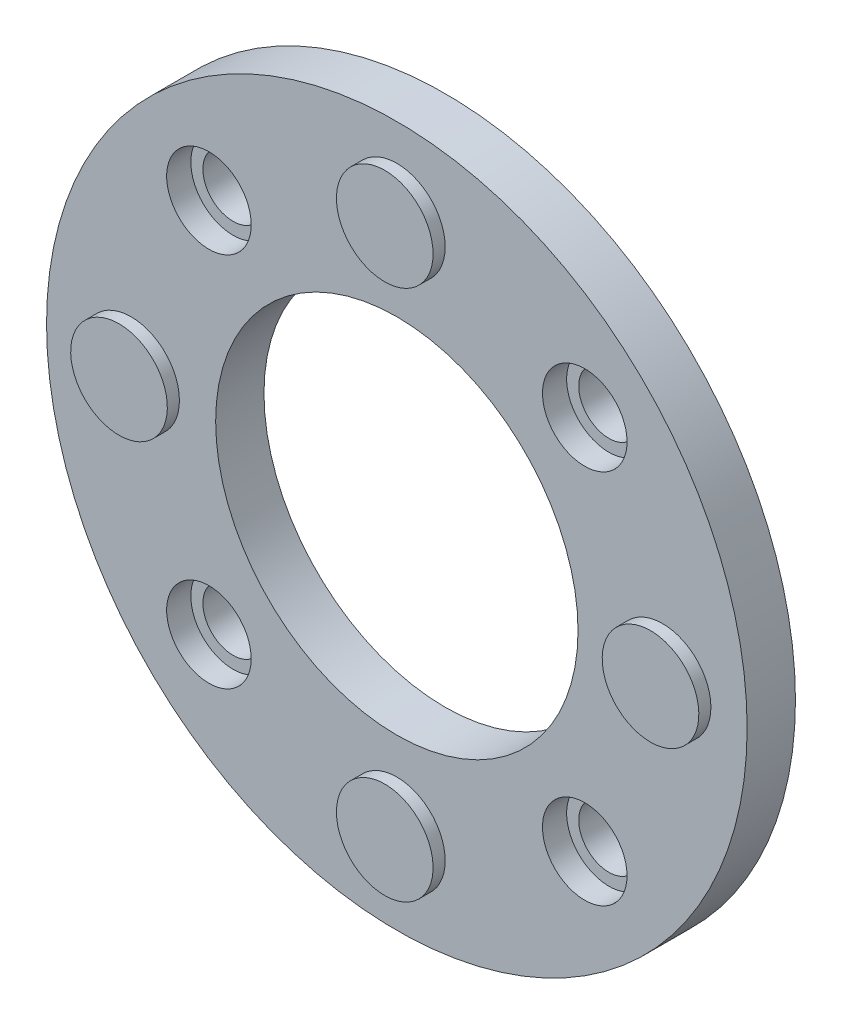
ISO-10303-21;
HEADER;
FILE_DESCRIPTION(('STEP AP214'),'2;1');
FILE_NAME('part.step','',(''),(''),'','','');
FILE_SCHEMA(('AUTOMOTIVE_DESIGN { 1 0 10303 214 1 1 1 1 }'));
ENDSEC;
DATA;
#1=APPLICATION_CONTEXT('core data for automotive mechanical design processes');
#2=APPLICATION_PROTOCOL_DEFINITION('international standard','automotive_design',2000,#1);
#3=PRODUCT_CONTEXT('',#1,'mechanical');
#4=PRODUCT('Part','Part','',(#3));
#5=PRODUCT_RELATED_PRODUCT_CATEGORY('part','',(#4));
#6=PRODUCT_DEFINITION_FORMATION('','',#4);
#7=PRODUCT_DEFINITION_CONTEXT('part definition',#1,'design');
#8=PRODUCT_DEFINITION('design','',#6,#7);
#9=PRODUCT_DEFINITION_SHAPE('','',#8);
#10=(LENGTH_UNIT() NAMED_UNIT(*) SI_UNIT(.MILLI.,.METRE.));
#11=(NAMED_UNIT(*) PLANE_ANGLE_UNIT() SI_UNIT($,.RADIAN.));
#12=(NAMED_UNIT(*) SI_UNIT($,.STERADIAN.) SOLID_ANGLE_UNIT());
#13=UNCERTAINTY_MEASURE_WITH_UNIT(LENGTH_MEASURE(1.E-05),#10,'distance_accuracy_value','');
#14=(GEOMETRIC_REPRESENTATION_CONTEXT(3) GLOBAL_UNCERTAINTY_ASSIGNED_CONTEXT((#13)) GLOBAL_UNIT_ASSIGNED_CONTEXT((#10,
#11,#12)) REPRESENTATION_CONTEXT('',''));
#15=CARTESIAN_POINT('',(0.,0.,0.));
#16=DIRECTION('',(0.,0.,1.));
#17=DIRECTION('',(1.,0.,0.));
#18=AXIS2_PLACEMENT_3D('',#15,#16,#17);
#19=CARTESIAN_POINT('',(0.,0.,-2.));
#20=DIRECTION('',(0.,0.,1.));
#21=DIRECTION('',(1.,0.,0.));
#22=AXIS2_PLACEMENT_3D('',#19,#20,#21);
#23=PLANE('',#22);
#24=CARTESIAN_POINT('',(15.5563491861041,-15.556349186104,-2.));
#25=DIRECTION('',(0.,0.,1.));
#26=DIRECTION('',(1.,0.,0.));
#27=AXIS2_PLACEMENT_3D('',#24,#25,#26);
#28=CIRCLE('',#27,3.5);
#29=CARTESIAN_POINT('',(19.0563491861041,-15.556349186104,-2.));
#30=VERTEX_POINT('',#29);
#31=EDGE_CURVE('E53',#30,#30,#28,.F.);
#32=ORIENTED_EDGE('',*,*,#31,.F.);
#33=EDGE_LOOP('',(#32));
#34=FACE_BOUND('',#33,.T.);
#35=CARTESIAN_POINT('',(-15.5563491861041,15.556349186104,-2.));
#36=DIRECTION('',(0.,0.,1.));
#37=DIRECTION('',(1.,0.,0.));
#38=AXIS2_PLACEMENT_3D('',#35,#36,#37);
#39=CIRCLE('',#38,3.5);
#40=CARTESIAN_POINT('',(-12.0563491861041,15.556349186104,-2.));
#41=VERTEX_POINT('',#40);
#42=EDGE_CURVE('E63',#41,#41,#39,.F.);
#43=ORIENTED_EDGE('',*,*,#42,.F.);
#44=EDGE_LOOP('',(#43));
#45=FACE_BOUND('',#44,.T.);
#46=CARTESIAN_POINT('',(-22.,0.,-2.));
#47=DIRECTION('',(0.,0.,1.));
#48=DIRECTION('',(1.,0.,0.));
#49=AXIS2_PLACEMENT_3D('',#46,#47,#48);
#50=CIRCLE('',#49,4.);
#51=CARTESIAN_POINT('',(-18.,0.,-2.));
#52=VERTEX_POINT('',#51);
#53=EDGE_CURVE('E69',#52,#52,#50,.F.);
#54=ORIENTED_EDGE('',*,*,#53,.F.);
#55=EDGE_LOOP('',(#54));
#56=FACE_BOUND('',#55,.T.);
#57=CARTESIAN_POINT('',(0.,-22.,-2.));
#58=DIRECTION('',(0.,0.,1.));
#59=DIRECTION('',(1.,0.,0.));
#60=AXIS2_PLACEMENT_3D('',#57,#58,#59);
#61=CIRCLE('',#60,4.);
#62=CARTESIAN_POINT('',(4.,-22.,-2.));
#63=VERTEX_POINT('',#62);
#64=EDGE_CURVE('E73',#63,#63,#61,.F.);
#65=ORIENTED_EDGE('',*,*,#64,.F.);
#66=EDGE_LOOP('',(#65));
#67=FACE_BOUND('',#66,.T.);
#68=CARTESIAN_POINT('',(22.,2.30437768363647E-13,-2.));
#69=DIRECTION('',(0.,0.,1.));
#70=DIRECTION('',(1.,0.,0.));
#71=AXIS2_PLACEMENT_3D('',#68,#69,#70);
#72=CIRCLE('',#71,4.);
#73=CARTESIAN_POINT('',(26.,2.30437768363647E-13,-2.));
#74=VERTEX_POINT('',#73);
#75=EDGE_CURVE('E77',#74,#74,#72,.F.);
#76=ORIENTED_EDGE('',*,*,#75,.F.);
#77=EDGE_LOOP('',(#76));
#78=FACE_BOUND('',#77,.T.);
#79=CARTESIAN_POINT('',(0.,22.,-2.));
#80=DIRECTION('',(0.,0.,1.));
#81=DIRECTION('',(1.,0.,0.));
#82=AXIS2_PLACEMENT_3D('',#79,#80,#81);
#83=CIRCLE('',#82,4.);
#84=CARTESIAN_POINT('',(4.,22.,-2.));
#85=VERTEX_POINT('',#84);
#86=EDGE_CURVE('E81',#85,#85,#83,.F.);
#87=ORIENTED_EDGE('',*,*,#86,.F.);
#88=EDGE_LOOP('',(#87));
#89=FACE_BOUND('',#88,.T.);
#90=CARTESIAN_POINT('',(0.,0.,-2.));
#91=DIRECTION('',(0.,0.,1.));
#92=DIRECTION('',(1.,0.,0.));
#93=AXIS2_PLACEMENT_3D('',#90,#91,#92);
#94=CIRCLE('',#93,29.);
#95=CARTESIAN_POINT('',(29.,0.,-2.));
#96=VERTEX_POINT('',#95);
#97=EDGE_CURVE('E86',#96,#96,#94,.T.);
#98=ORIENTED_EDGE('',*,*,#97,.F.);
#99=EDGE_LOOP('',(#98));
#100=FACE_BOUND('',#99,.T.);
#101=CARTESIAN_POINT('',(0.,0.,-2.));
#102=DIRECTION('',(0.,0.,1.));
#103=DIRECTION('',(1.,0.,0.));
#104=AXIS2_PLACEMENT_3D('',#101,#102,#103);
#105=CIRCLE('',#104,15.);
#106=CARTESIAN_POINT('',(15.,0.,-2.));
#107=VERTEX_POINT('',#106);
#108=EDGE_CURVE('E94',#107,#107,#105,.T.);
#109=ORIENTED_EDGE('',*,*,#108,.T.);
#110=EDGE_LOOP('',(#109));
#111=FACE_BOUND('',#110,.T.);
#112=CARTESIAN_POINT('',(-15.5563491861042,-15.5563491861039,-2.));
#113=DIRECTION('',(0.,0.,1.));
#114=DIRECTION('',(1.,0.,0.));
#115=AXIS2_PLACEMENT_3D('',#112,#113,#114);
#116=CIRCLE('',#115,3.5);
#117=CARTESIAN_POINT('',(-12.0563491861042,-15.5563491861039,-2.));
#118=VERTEX_POINT('',#117);
#119=EDGE_CURVE('E58',#118,#118,#116,.F.);
#120=ORIENTED_EDGE('',*,*,#119,.F.);
#121=EDGE_LOOP('',(#120));
#122=FACE_BOUND('',#121,.T.);
#123=CARTESIAN_POINT('',(15.5563491861041,15.556349186104,-2.));
#124=DIRECTION('',(0.,0.,1.));
#125=DIRECTION('',(1.,0.,0.));
#126=AXIS2_PLACEMENT_3D('',#123,#124,#125);
#127=CIRCLE('',#126,3.5);
#128=CARTESIAN_POINT('',(19.0563491861041,15.556349186104,-2.));
#129=VERTEX_POINT('',#128);
#130=EDGE_CURVE('E10',#129,#129,#127,.F.);
#131=ORIENTED_EDGE('',*,*,#130,.F.);
#132=EDGE_LOOP('',(#131));
#133=FACE_BOUND('',#132,.T.);
#134=ADVANCED_FACE('F45',(#34,#45,#56,#67,#78,#89,#100,#111,#122,#133),#23,.F.);
#135=CARTESIAN_POINT('',(0.,0.,2.));
#136=DIRECTION('',(0.,0.,1.));
#137=DIRECTION('',(1.,0.,0.));
#138=AXIS2_PLACEMENT_3D('',#135,#136,#137);
#139=PLANE('',#138);
#140=CARTESIAN_POINT('',(-15.5563491861042,-15.5563491861039,2.));
#141=DIRECTION('',(0.,0.,1.));
#142=DIRECTION('',(1.,0.,0.));
#143=AXIS2_PLACEMENT_3D('',#140,#141,#142);
#144=CIRCLE('',#143,3.50000000000001);
#145=CARTESIAN_POINT('',(-12.0563491861042,-15.5563491861039,2.));
#146=VERTEX_POINT('',#145);
#147=EDGE_CURVE('E233',#146,#146,#144,.T.);
#148=ORIENTED_EDGE('',*,*,#147,.F.);
#149=EDGE_LOOP('',(#148));
#150=FACE_BOUND('',#149,.T.);
#151=CARTESIAN_POINT('',(15.5563491861041,-15.556349186104,2.));
#152=DIRECTION('',(0.,0.,1.));
#153=DIRECTION('',(1.,0.,0.));
#154=AXIS2_PLACEMENT_3D('',#151,#152,#153);
#155=CIRCLE('',#154,3.50000000000002);
#156=CARTESIAN_POINT('',(19.0563491861041,-15.556349186104,2.));
#157=VERTEX_POINT('',#156);
#158=EDGE_CURVE('E221',#157,#157,#155,.T.);
#159=ORIENTED_EDGE('',*,*,#158,.F.);
#160=EDGE_LOOP('',(#159));
#161=FACE_BOUND('',#160,.T.);
#162=CARTESIAN_POINT('',(15.5563491861041,15.556349186104,2.));
#163=DIRECTION('',(0.,0.,1.));
#164=DIRECTION('',(1.,0.,0.));
#165=AXIS2_PLACEMENT_3D('',#162,#163,#164);
#166=CIRCLE('',#165,3.50000000000002);
#167=CARTESIAN_POINT('',(19.0563491861041,15.556349186104,2.));
#168=VERTEX_POINT('',#167);
#169=EDGE_CURVE('E209',#168,#168,#166,.T.);
#170=ORIENTED_EDGE('',*,*,#169,.F.);
#171=EDGE_LOOP('',(#170));
#172=FACE_BOUND('',#171,.T.);
#173=CARTESIAN_POINT('',(-15.5563491861041,15.556349186104,2.));
#174=DIRECTION('',(0.,0.,1.));
#175=DIRECTION('',(1.,0.,0.));
#176=AXIS2_PLACEMENT_3D('',#173,#174,#175);
#177=CIRCLE('',#176,3.50000000000001);
#178=CARTESIAN_POINT('',(-12.0563491861041,15.556349186104,2.));
#179=VERTEX_POINT('',#178);
#180=EDGE_CURVE('E189',#179,#179,#177,.T.);
#181=ORIENTED_EDGE('',*,*,#180,.F.);
#182=EDGE_LOOP('',(#181));
#183=FACE_BOUND('',#182,.T.);
#184=CARTESIAN_POINT('',(-22.,0.,2.));
#185=DIRECTION('',(0.,0.,1.));
#186=DIRECTION('',(1.,0.,0.));
#187=AXIS2_PLACEMENT_3D('',#184,#185,#186);
#188=CIRCLE('',#187,4.);
#189=CARTESIAN_POINT('',(-18.,0.,2.));
#190=VERTEX_POINT('',#189);
#191=EDGE_CURVE('E118',#190,#190,#188,.F.);
#192=ORIENTED_EDGE('',*,*,#191,.T.);
#193=EDGE_LOOP('',(#192));
#194=FACE_BOUND('',#193,.T.);
#195=CARTESIAN_POINT('',(0.,-22.,2.));
#196=DIRECTION('',(0.,0.,1.));
#197=DIRECTION('',(1.,0.,0.));
#198=AXIS2_PLACEMENT_3D('',#195,#196,#197);
#199=CIRCLE('',#198,4.);
#200=CARTESIAN_POINT('',(4.,-22.,2.));
#201=VERTEX_POINT('',#200);
#202=EDGE_CURVE('E125',#201,#201,#199,.F.);
#203=ORIENTED_EDGE('',*,*,#202,.T.);
#204=EDGE_LOOP('',(#203));
#205=FACE_BOUND('',#204,.T.);
#206=CARTESIAN_POINT('',(22.,2.30437768363647E-13,2.));
#207=DIRECTION('',(0.,0.,1.));
#208=DIRECTION('',(1.,0.,0.));
#209=AXIS2_PLACEMENT_3D('',#206,#207,#208);
#210=CIRCLE('',#209,4.);
#211=CARTESIAN_POINT('',(26.,2.30437768363647E-13,2.));
#212=VERTEX_POINT('',#211);
#213=EDGE_CURVE('E129',#212,#212,#210,.F.);
#214=ORIENTED_EDGE('',*,*,#213,.T.);
#215=EDGE_LOOP('',(#214));
#216=FACE_BOUND('',#215,.T.);
#217=CARTESIAN_POINT('',(0.,22.,2.));
#218=DIRECTION('',(0.,0.,1.));
#219=DIRECTION('',(1.,0.,0.));
#220=AXIS2_PLACEMENT_3D('',#217,#218,#219);
#221=CIRCLE('',#220,4.);
#222=CARTESIAN_POINT('',(4.,22.,2.));
#223=VERTEX_POINT('',#222);
#224=EDGE_CURVE('E98',#223,#223,#221,.F.);
#225=ORIENTED_EDGE('',*,*,#224,.T.);
#226=EDGE_LOOP('',(#225));
#227=FACE_BOUND('',#226,.T.);
#228=CARTESIAN_POINT('',(0.,0.,2.));
#229=DIRECTION('',(0.,0.,1.));
#230=DIRECTION('',(1.,0.,0.));
#231=AXIS2_PLACEMENT_3D('',#228,#229,#230);
#232=CIRCLE('',#231,29.);
#233=CARTESIAN_POINT('',(29.,0.,2.));
#234=VERTEX_POINT('',#233);
#235=EDGE_CURVE('E85',#234,#234,#232,.T.);
#236=ORIENTED_EDGE('',*,*,#235,.T.);
#237=EDGE_LOOP('',(#236));
#238=FACE_BOUND('',#237,.T.);
#239=CARTESIAN_POINT('',(0.,0.,2.));
#240=DIRECTION('',(0.,0.,1.));
#241=DIRECTION('',(1.,0.,0.));
#242=AXIS2_PLACEMENT_3D('',#239,#240,#241);
#243=CIRCLE('',#242,15.);
#244=CARTESIAN_POINT('',(15.,0.,2.));
#245=VERTEX_POINT('',#244);
#246=EDGE_CURVE('E90',#245,#245,#243,.T.);
#247=ORIENTED_EDGE('',*,*,#246,.F.);
#248=EDGE_LOOP('',(#247));
#249=FACE_BOUND('',#248,.T.);
#250=ADVANCED_FACE('F275',(#150,#161,#172,#183,#194,#205,#216,#227,#238,#249),#139,.T.);
#251=CARTESIAN_POINT('',(0.,0.,2.));
#252=DIRECTION('',(0.,0.,-1.));
#253=DIRECTION('',(-1.,0.,0.));
#254=AXIS2_PLACEMENT_3D('',#251,#252,#253);
#255=CYLINDRICAL_SURFACE('',#254,29.);
#256=ORIENTED_EDGE('',*,*,#235,.F.);
#257=EDGE_LOOP('',(#256));
#258=FACE_BOUND('',#257,.T.);
#259=ORIENTED_EDGE('',*,*,#97,.T.);
#260=EDGE_LOOP('',(#259));
#261=FACE_BOUND('',#260,.T.);
#262=ADVANCED_FACE('F47',(#258,#261),#255,.T.);
#263=CARTESIAN_POINT('',(0.,0.,2.));
#264=DIRECTION('',(0.,0.,-1.));
#265=DIRECTION('',(-1.,0.,0.));
#266=AXIS2_PLACEMENT_3D('',#263,#264,#265);
#267=CYLINDRICAL_SURFACE('',#266,15.);
#268=ORIENTED_EDGE('',*,*,#246,.T.);
#269=EDGE_LOOP('',(#268));
#270=FACE_BOUND('',#269,.T.);
#271=ORIENTED_EDGE('',*,*,#108,.F.);
#272=EDGE_LOOP('',(#271));
#273=FACE_BOUND('',#272,.T.);
#274=ADVANCED_FACE('F285',(#270,#273),#267,.F.);
#275=CARTESIAN_POINT('',(0.,22.,-3.));
#276=DIRECTION('',(0.,0.,1.));
#277=DIRECTION('',(1.,0.,0.));
#278=AXIS2_PLACEMENT_3D('',#275,#276,#277);
#279=PLANE('',#278);
#280=CARTESIAN_POINT('',(0.,22.,-3.));
#281=DIRECTION('',(0.,0.,-1.));
#282=DIRECTION('',(-1.,0.,0.));
#283=AXIS2_PLACEMENT_3D('',#280,#281,#282);
#284=CIRCLE('',#283,2.5);
#285=CARTESIAN_POINT('',(-2.5,22.,-3.));
#286=VERTEX_POINT('',#285);
#287=EDGE_CURVE('E114',#286,#286,#284,.T.);
#288=ORIENTED_EDGE('',*,*,#287,.F.);
#289=EDGE_LOOP('',(#288));
#290=FACE_BOUND('',#289,.T.);
#291=CARTESIAN_POINT('',(0.,22.,-3.));
#292=DIRECTION('',(0.,0.,1.));
#293=DIRECTION('',(1.,0.,0.));
#294=AXIS2_PLACEMENT_3D('',#291,#292,#293);
#295=CIRCLE('',#294,4.);
#296=CARTESIAN_POINT('',(4.,22.,-3.));
#297=VERTEX_POINT('',#296);
#298=EDGE_CURVE('E106',#297,#297,#295,.T.);
#299=ORIENTED_EDGE('',*,*,#298,.F.);
#300=EDGE_LOOP('',(#299));
#301=FACE_BOUND('',#300,.T.);
#302=ADVANCED_FACE('F288',(#290,#301),#279,.F.);
#303=CARTESIAN_POINT('',(0.,22.,3.));
#304=DIRECTION('',(0.,0.,-1.));
#305=DIRECTION('',(-1.,0.,0.));
#306=AXIS2_PLACEMENT_3D('',#303,#304,#305);
#307=CYLINDRICAL_SURFACE('',#306,4.);
#308=ORIENTED_EDGE('',*,*,#298,.T.);
#309=EDGE_LOOP('',(#308));
#310=FACE_BOUND('',#309,.T.);
#311=ORIENTED_EDGE('',*,*,#86,.T.);
#312=EDGE_LOOP('',(#311));
#313=FACE_BOUND('',#312,.T.);
#314=ADVANCED_FACE('F294',(#310,#313),#307,.T.);
#315=ORIENTED_EDGE('',*,*,#224,.F.);
#316=EDGE_LOOP('',(#315));
#317=FACE_BOUND('',#316,.T.);
#318=CARTESIAN_POINT('',(0.,22.,3.));
#319=DIRECTION('',(0.,0.,1.));
#320=DIRECTION('',(1.,0.,0.));
#321=AXIS2_PLACEMENT_3D('',#318,#319,#320);
#322=CIRCLE('',#321,4.);
#323=CARTESIAN_POINT('',(4.,22.,3.));
#324=VERTEX_POINT('',#323);
#325=EDGE_CURVE('E105',#324,#324,#322,.T.);
#326=ORIENTED_EDGE('',*,*,#325,.F.);
#327=EDGE_LOOP('',(#326));
#328=FACE_BOUND('',#327,.T.);
#329=ADVANCED_FACE('F290',(#317,#328),#307,.T.);
#330=CARTESIAN_POINT('',(0.,22.,3.));
#331=DIRECTION('',(0.,0.,1.));
#332=DIRECTION('',(1.,0.,0.));
#333=AXIS2_PLACEMENT_3D('',#330,#331,#332);
#334=PLANE('',#333);
#335=ORIENTED_EDGE('',*,*,#325,.T.);
#336=EDGE_LOOP('',(#335));
#337=FACE_BOUND('',#336,.T.);
#338=ADVANCED_FACE('F293',(#337),#334,.T.);
#339=CARTESIAN_POINT('',(0.,22.,1.5));
#340=DIRECTION('',(0.,0.,-1.));
#341=DIRECTION('',(-1.,0.,0.));
#342=AXIS2_PLACEMENT_3D('',#339,#340,#341);
#343=CYLINDRICAL_SURFACE('',#342,2.5);
#344=CARTESIAN_POINT('',(0.,22.,1.5));
#345=DIRECTION('',(0.,0.,-1.));
#346=DIRECTION('',(-1.,0.,0.));
#347=AXIS2_PLACEMENT_3D('',#344,#345,#346);
#348=CIRCLE('',#347,2.5);
#349=CARTESIAN_POINT('',(-2.5,22.,1.5));
#350=VERTEX_POINT('',#349);
#351=EDGE_CURVE('E110',#350,#350,#348,.T.);
#352=ORIENTED_EDGE('',*,*,#351,.F.);
#353=EDGE_LOOP('',(#352));
#354=FACE_BOUND('',#353,.T.);
#355=ORIENTED_EDGE('',*,*,#287,.T.);
#356=EDGE_LOOP('',(#355));
#357=FACE_BOUND('',#356,.T.);
#358=ADVANCED_FACE('F301',(#354,#357),#343,.F.);
#359=CARTESIAN_POINT('',(0.,22.,1.5));
#360=DIRECTION('',(0.,0.,-1.));
#361=DIRECTION('',(-1.,0.,0.));
#362=AXIS2_PLACEMENT_3D('',#359,#360,#361);
#363=PLANE('',#362);
#364=ORIENTED_EDGE('',*,*,#351,.T.);
#365=EDGE_LOOP('',(#364));
#366=FACE_BOUND('',#365,.T.);
#367=ADVANCED_FACE('F305',(#366),#363,.T.);
#368=CARTESIAN_POINT('',(22.,2.30437768363647E-13,-3.));
#369=DIRECTION('',(0.,0.,1.));
#370=DIRECTION('',(0.,-1.,0.));
#371=AXIS2_PLACEMENT_3D('',#368,#369,#370);
#372=PLANE('',#371);
#373=CARTESIAN_POINT('',(22.,2.30437768363647E-13,-3.));
#374=DIRECTION('',(0.,0.,-1.));
#375=DIRECTION('',(0.,1.,0.));
#376=AXIS2_PLACEMENT_3D('',#373,#374,#375);
#377=CIRCLE('',#376,2.5);
#378=CARTESIAN_POINT('',(22.,2.50000000000023,-3.));
#379=VERTEX_POINT('',#378);
#380=EDGE_CURVE('E158',#379,#379,#377,.T.);
#381=ORIENTED_EDGE('',*,*,#380,.F.);
#382=EDGE_LOOP('',(#381));
#383=FACE_BOUND('',#382,.T.);
#384=CARTESIAN_POINT('',(22.,2.30437768363647E-13,-3.));
#385=DIRECTION('',(0.,0.,1.));
#386=DIRECTION('',(0.,-1.,0.));
#387=AXIS2_PLACEMENT_3D('',#384,#385,#386);
#388=CIRCLE('',#387,4.);
#389=CARTESIAN_POINT('',(22.,-3.99999999999977,-3.));
#390=VERTEX_POINT('',#389);
#391=EDGE_CURVE('E134',#390,#390,#388,.T.);
#392=ORIENTED_EDGE('',*,*,#391,.F.);
#393=EDGE_LOOP('',(#392));
#394=FACE_BOUND('',#393,.T.);
#395=ADVANCED_FACE('F309',(#383,#394),#372,.F.);
#396=CARTESIAN_POINT('',(22.,2.30437768363647E-13,3.));
#397=DIRECTION('',(0.,0.,-1.));
#398=DIRECTION('',(-1.,0.,0.));
#399=AXIS2_PLACEMENT_3D('',#396,#397,#398);
#400=CYLINDRICAL_SURFACE('',#399,4.);
#401=ORIENTED_EDGE('',*,*,#391,.T.);
#402=EDGE_LOOP('',(#401));
#403=FACE_BOUND('',#402,.T.);
#404=ORIENTED_EDGE('',*,*,#75,.T.);
#405=EDGE_LOOP('',(#404));
#406=FACE_BOUND('',#405,.T.);
#407=ADVANCED_FACE('F317',(#403,#406),#400,.T.);
#408=CARTESIAN_POINT('',(0.,-22.,-3.));
#409=DIRECTION('',(0.,0.,1.));
#410=DIRECTION('',(-1.,0.,0.));
#411=AXIS2_PLACEMENT_3D('',#408,#409,#410);
#412=PLANE('',#411);
#413=CARTESIAN_POINT('',(0.,-22.,-3.));
#414=DIRECTION('',(0.,0.,-1.));
#415=DIRECTION('',(1.,0.,0.));
#416=AXIS2_PLACEMENT_3D('',#413,#414,#415);
#417=CIRCLE('',#416,2.5);
#418=CARTESIAN_POINT('',(2.5,-22.,-3.));
#419=VERTEX_POINT('',#418);
#420=EDGE_CURVE('E167',#419,#419,#417,.T.);
#421=ORIENTED_EDGE('',*,*,#420,.F.);
#422=EDGE_LOOP('',(#421));
#423=FACE_BOUND('',#422,.T.);
#424=CARTESIAN_POINT('',(0.,-22.,-3.));
#425=DIRECTION('',(0.,0.,1.));
#426=DIRECTION('',(-1.,0.,0.));
#427=AXIS2_PLACEMENT_3D('',#424,#425,#426);
#428=CIRCLE('',#427,4.);
#429=CARTESIAN_POINT('',(-4.,-22.,-3.));
#430=VERTEX_POINT('',#429);
#431=EDGE_CURVE('E143',#430,#430,#428,.T.);
#432=ORIENTED_EDGE('',*,*,#431,.F.);
#433=EDGE_LOOP('',(#432));
#434=FACE_BOUND('',#433,.T.);
#435=ADVANCED_FACE('F330',(#423,#434),#412,.F.);
#436=CARTESIAN_POINT('',(0.,-22.,3.));
#437=DIRECTION('',(0.,0.,-1.));
#438=DIRECTION('',(-1.,0.,0.));
#439=AXIS2_PLACEMENT_3D('',#436,#437,#438);
#440=CYLINDRICAL_SURFACE('',#439,4.);
#441=ORIENTED_EDGE('',*,*,#431,.T.);
#442=EDGE_LOOP('',(#441));
#443=FACE_BOUND('',#442,.T.);
#444=ORIENTED_EDGE('',*,*,#64,.T.);
#445=EDGE_LOOP('',(#444));
#446=FACE_BOUND('',#445,.T.);
#447=ADVANCED_FACE('F329',(#443,#446),#440,.T.);
#448=CARTESIAN_POINT('',(-22.,0.,-3.));
#449=DIRECTION('',(0.,0.,1.));
#450=DIRECTION('',(0.,1.,0.));
#451=AXIS2_PLACEMENT_3D('',#448,#449,#450);
#452=PLANE('',#451);
#453=CARTESIAN_POINT('',(-22.,0.,-3.));
#454=DIRECTION('',(0.,0.,-1.));
#455=DIRECTION('',(0.,-1.,0.));
#456=AXIS2_PLACEMENT_3D('',#453,#454,#455);
#457=CIRCLE('',#456,2.5);
#458=CARTESIAN_POINT('',(-22.,-2.50000000000008,-3.));
#459=VERTEX_POINT('',#458);
#460=EDGE_CURVE('E175',#459,#459,#457,.T.);
#461=ORIENTED_EDGE('',*,*,#460,.F.);
#462=EDGE_LOOP('',(#461));
#463=FACE_BOUND('',#462,.T.);
#464=CARTESIAN_POINT('',(-22.,0.,-3.));
#465=DIRECTION('',(0.,0.,1.));
#466=DIRECTION('',(0.,1.,0.));
#467=AXIS2_PLACEMENT_3D('',#464,#465,#466);
#468=CIRCLE('',#467,4.);
#469=CARTESIAN_POINT('',(-22.,3.99999999999992,-3.));
#470=VERTEX_POINT('',#469);
#471=EDGE_CURVE('E151',#470,#470,#468,.T.);
#472=ORIENTED_EDGE('',*,*,#471,.F.);
#473=EDGE_LOOP('',(#472));
#474=FACE_BOUND('',#473,.T.);
#475=ADVANCED_FACE('F342',(#463,#474),#452,.F.);
#476=CARTESIAN_POINT('',(-22.,0.,3.));
#477=DIRECTION('',(0.,0.,-1.));
#478=DIRECTION('',(-1.,0.,0.));
#479=AXIS2_PLACEMENT_3D('',#476,#477,#478);
#480=CYLINDRICAL_SURFACE('',#479,4.);
#481=ORIENTED_EDGE('',*,*,#471,.T.);
#482=EDGE_LOOP('',(#481));
#483=FACE_BOUND('',#482,.T.);
#484=ORIENTED_EDGE('',*,*,#53,.T.);
#485=EDGE_LOOP('',(#484));
#486=FACE_BOUND('',#485,.T.);
#487=ADVANCED_FACE('F315',(#483,#486),#480,.T.);
#488=ORIENTED_EDGE('',*,*,#213,.F.);
#489=EDGE_LOOP('',(#488));
#490=FACE_BOUND('',#489,.T.);
#491=CARTESIAN_POINT('',(22.,2.30437768363647E-13,3.));
#492=DIRECTION('',(0.,0.,1.));
#493=DIRECTION('',(0.,-1.,0.));
#494=AXIS2_PLACEMENT_3D('',#491,#492,#493);
#495=CIRCLE('',#494,4.);
#496=CARTESIAN_POINT('',(22.,-3.99999999999977,3.));
#497=VERTEX_POINT('',#496);
#498=EDGE_CURVE('E138',#497,#497,#495,.T.);
#499=ORIENTED_EDGE('',*,*,#498,.F.);
#500=EDGE_LOOP('',(#499));
#501=FACE_BOUND('',#500,.T.);
#502=ADVANCED_FACE('F311',(#490,#501),#400,.T.);
#503=CARTESIAN_POINT('',(22.,2.30437768363647E-13,3.));
#504=DIRECTION('',(0.,0.,1.));
#505=DIRECTION('',(0.,-1.,0.));
#506=AXIS2_PLACEMENT_3D('',#503,#504,#505);
#507=PLANE('',#506);
#508=ORIENTED_EDGE('',*,*,#498,.T.);
#509=EDGE_LOOP('',(#508));
#510=FACE_BOUND('',#509,.T.);
#511=ADVANCED_FACE('F314',(#510),#507,.T.);
#512=ORIENTED_EDGE('',*,*,#202,.F.);
#513=EDGE_LOOP('',(#512));
#514=FACE_BOUND('',#513,.T.);
#515=CARTESIAN_POINT('',(0.,-22.,3.));
#516=DIRECTION('',(0.,0.,1.));
#517=DIRECTION('',(-1.,0.,0.));
#518=AXIS2_PLACEMENT_3D('',#515,#516,#517);
#519=CIRCLE('',#518,4.);
#520=CARTESIAN_POINT('',(-4.,-22.,3.));
#521=VERTEX_POINT('',#520);
#522=EDGE_CURVE('E147',#521,#521,#519,.T.);
#523=ORIENTED_EDGE('',*,*,#522,.F.);
#524=EDGE_LOOP('',(#523));
#525=FACE_BOUND('',#524,.T.);
#526=ADVANCED_FACE('F323',(#514,#525),#440,.T.);
#527=CARTESIAN_POINT('',(0.,-22.,3.));
#528=DIRECTION('',(0.,0.,1.));
#529=DIRECTION('',(-1.,0.,0.));
#530=AXIS2_PLACEMENT_3D('',#527,#528,#529);
#531=PLANE('',#530);
#532=ORIENTED_EDGE('',*,*,#522,.T.);
#533=EDGE_LOOP('',(#532));
#534=FACE_BOUND('',#533,.T.);
#535=ADVANCED_FACE('F327',(#534),#531,.T.);
#536=ORIENTED_EDGE('',*,*,#191,.F.);
#537=EDGE_LOOP('',(#536));
#538=FACE_BOUND('',#537,.T.);
#539=CARTESIAN_POINT('',(-22.,0.,3.));
#540=DIRECTION('',(0.,0.,1.));
#541=DIRECTION('',(0.,1.,0.));
#542=AXIS2_PLACEMENT_3D('',#539,#540,#541);
#543=CIRCLE('',#542,4.);
#544=CARTESIAN_POINT('',(-22.,3.99999999999992,3.));
#545=VERTEX_POINT('',#544);
#546=EDGE_CURVE('E133',#545,#545,#543,.T.);
#547=ORIENTED_EDGE('',*,*,#546,.F.);
#548=EDGE_LOOP('',(#547));
#549=FACE_BOUND('',#548,.T.);
#550=ADVANCED_FACE('F336',(#538,#549),#480,.T.);
#551=CARTESIAN_POINT('',(-22.,0.,3.));
#552=DIRECTION('',(0.,0.,1.));
#553=DIRECTION('',(0.,1.,0.));
#554=AXIS2_PLACEMENT_3D('',#551,#552,#553);
#555=PLANE('',#554);
#556=ORIENTED_EDGE('',*,*,#546,.T.);
#557=EDGE_LOOP('',(#556));
#558=FACE_BOUND('',#557,.T.);
#559=ADVANCED_FACE('F340',(#558),#555,.T.);
#560=CARTESIAN_POINT('',(-22.,0.,1.5));
#561=DIRECTION('',(0.,0.,-1.));
#562=DIRECTION('',(-1.,0.,0.));
#563=AXIS2_PLACEMENT_3D('',#560,#561,#562);
#564=CYLINDRICAL_SURFACE('',#563,2.5);
#565=CARTESIAN_POINT('',(-22.,0.,1.5));
#566=DIRECTION('',(0.,0.,-1.));
#567=DIRECTION('',(0.,-1.,0.));
#568=AXIS2_PLACEMENT_3D('',#565,#566,#567);
#569=CIRCLE('',#568,2.5);
#570=CARTESIAN_POINT('',(-22.,-2.50000000000008,1.5));
#571=VERTEX_POINT('',#570);
#572=EDGE_CURVE('E139',#571,#571,#569,.T.);
#573=ORIENTED_EDGE('',*,*,#572,.F.);
#574=EDGE_LOOP('',(#573));
#575=FACE_BOUND('',#574,.T.);
#576=ORIENTED_EDGE('',*,*,#460,.T.);
#577=EDGE_LOOP('',(#576));
#578=FACE_BOUND('',#577,.T.);
#579=ADVANCED_FACE('F348',(#575,#578),#564,.F.);
#580=CARTESIAN_POINT('',(-22.,0.,1.5));
#581=DIRECTION('',(0.,0.,-1.));
#582=DIRECTION('',(0.,-1.,0.));
#583=AXIS2_PLACEMENT_3D('',#580,#581,#582);
#584=PLANE('',#583);
#585=ORIENTED_EDGE('',*,*,#572,.T.);
#586=EDGE_LOOP('',(#585));
#587=FACE_BOUND('',#586,.T.);
#588=ADVANCED_FACE('F363',(#587),#584,.T.);
#589=CARTESIAN_POINT('',(0.,-22.,1.5));
#590=DIRECTION('',(0.,0.,-1.));
#591=DIRECTION('',(-1.,0.,0.));
#592=AXIS2_PLACEMENT_3D('',#589,#590,#591);
#593=CYLINDRICAL_SURFACE('',#592,2.5);
#594=CARTESIAN_POINT('',(0.,-22.,1.5));
#595=DIRECTION('',(0.,0.,-1.));
#596=DIRECTION('',(1.,0.,0.));
#597=AXIS2_PLACEMENT_3D('',#594,#595,#596);
#598=CIRCLE('',#597,2.5);
#599=CARTESIAN_POINT('',(2.5,-22.,1.5));
#600=VERTEX_POINT('',#599);
#601=EDGE_CURVE('E171',#600,#600,#598,.T.);
#602=ORIENTED_EDGE('',*,*,#601,.F.);
#603=EDGE_LOOP('',(#602));
#604=FACE_BOUND('',#603,.T.);
#605=ORIENTED_EDGE('',*,*,#420,.T.);
#606=EDGE_LOOP('',(#605));
#607=FACE_BOUND('',#606,.T.);
#608=ADVANCED_FACE('F360',(#604,#607),#593,.F.);
#609=CARTESIAN_POINT('',(0.,-22.,1.5));
#610=DIRECTION('',(0.,0.,-1.));
#611=DIRECTION('',(1.,0.,0.));
#612=AXIS2_PLACEMENT_3D('',#609,#610,#611);
#613=PLANE('',#612);
#614=ORIENTED_EDGE('',*,*,#601,.T.);
#615=EDGE_LOOP('',(#614));
#616=FACE_BOUND('',#615,.T.);
#617=ADVANCED_FACE('F354',(#616),#613,.T.);
#618=CARTESIAN_POINT('',(22.,2.30437768363647E-13,1.5));
#619=DIRECTION('',(0.,0.,-1.));
#620=DIRECTION('',(-1.,0.,0.));
#621=AXIS2_PLACEMENT_3D('',#618,#619,#620);
#622=CYLINDRICAL_SURFACE('',#621,2.5);
#623=CARTESIAN_POINT('',(22.,2.30437768363647E-13,1.5));
#624=DIRECTION('',(0.,0.,-1.));
#625=DIRECTION('',(0.,1.,0.));
#626=AXIS2_PLACEMENT_3D('',#623,#624,#625);
#627=CIRCLE('',#626,2.5);
#628=CARTESIAN_POINT('',(22.,2.50000000000023,1.5));
#629=VERTEX_POINT('',#628);
#630=EDGE_CURVE('E162',#629,#629,#627,.T.);
#631=ORIENTED_EDGE('',*,*,#630,.F.);
#632=EDGE_LOOP('',(#631));
#633=FACE_BOUND('',#632,.T.);
#634=ORIENTED_EDGE('',*,*,#380,.T.);
#635=EDGE_LOOP('',(#634));
#636=FACE_BOUND('',#635,.T.);
#637=ADVANCED_FACE('F350',(#633,#636),#622,.F.);
#638=CARTESIAN_POINT('',(22.,2.30437768363647E-13,1.5));
#639=DIRECTION('',(0.,0.,-1.));
#640=DIRECTION('',(0.,1.,0.));
#641=AXIS2_PLACEMENT_3D('',#638,#639,#640);
#642=PLANE('',#641);
#643=ORIENTED_EDGE('',*,*,#630,.T.);
#644=EDGE_LOOP('',(#643));
#645=FACE_BOUND('',#644,.T.);
#646=ADVANCED_FACE('F353',(#645),#642,.T.);
#647=CARTESIAN_POINT('',(-15.5563491861041,15.556349186104,2.));
#648=DIRECTION('',(0.,0.,1.));
#649=DIRECTION('',(1.,0.,0.));
#650=AXIS2_PLACEMENT_3D('',#647,#648,#649);
#651=CYLINDRICAL_SURFACE('',#650,2.50000000000001);
#652=CARTESIAN_POINT('',(-15.5563491861041,15.556349186104,0.));
#653=DIRECTION('',(0.,0.,1.));
#654=DIRECTION('',(1.,0.,0.));
#655=AXIS2_PLACEMENT_3D('',#652,#653,#654);
#656=CIRCLE('',#655,2.50000000000001);
#657=CARTESIAN_POINT('',(-13.0563491861041,15.556349186104,0.));
#658=VERTEX_POINT('',#657);
#659=EDGE_CURVE('E163',#658,#658,#656,.T.);
#660=ORIENTED_EDGE('',*,*,#659,.T.);
#661=EDGE_LOOP('',(#660));
#662=FACE_BOUND('',#661,.T.);
#663=CARTESIAN_POINT('',(-15.5563491861041,15.556349186104,-3.));
#664=DIRECTION('',(0.,0.,1.));
#665=DIRECTION('',(1.,0.,0.));
#666=AXIS2_PLACEMENT_3D('',#663,#664,#665);
#667=CIRCLE('',#666,2.50000000000002);
#668=CARTESIAN_POINT('',(-13.0563491861041,15.556349186104,-3.));
#669=VERTEX_POINT('',#668);
#670=EDGE_CURVE('E193',#669,#669,#667,.T.);
#671=ORIENTED_EDGE('',*,*,#670,.F.);
#672=EDGE_LOOP('',(#671));
#673=FACE_BOUND('',#672,.T.);
#674=ADVANCED_FACE('F358',(#662,#673),#651,.F.);
#675=CARTESIAN_POINT('',(-13.0563491861041,15.556349186104,0.));
#676=DIRECTION('',(0.,0.,-1.));
#677=DIRECTION('',(-1.,0.,0.));
#678=AXIS2_PLACEMENT_3D('',#675,#676,#677);
#679=PLANE('',#678);
#680=ORIENTED_EDGE('',*,*,#659,.F.);
#681=EDGE_LOOP('',(#680));
#682=FACE_BOUND('',#681,.T.);
#683=CARTESIAN_POINT('',(-15.5563491861041,15.556349186104,0.));
#684=DIRECTION('',(0.,0.,1.));
#685=DIRECTION('',(1.,0.,0.));
#686=AXIS2_PLACEMENT_3D('',#683,#684,#685);
#687=CIRCLE('',#686,3.50000000000001);
#688=CARTESIAN_POINT('',(-12.0563491861041,15.556349186104,0.));
#689=VERTEX_POINT('',#688);
#690=EDGE_CURVE('E185',#689,#689,#687,.T.);
#691=ORIENTED_EDGE('',*,*,#690,.T.);
#692=EDGE_LOOP('',(#691));
#693=FACE_BOUND('',#692,.T.);
#694=ADVANCED_FACE('F376',(#682,#693),#679,.F.);
#695=CARTESIAN_POINT('',(-15.5563491861041,15.556349186104,2.));
#696=DIRECTION('',(0.,0.,1.));
#697=DIRECTION('',(1.,0.,0.));
#698=AXIS2_PLACEMENT_3D('',#695,#696,#697);
#699=CYLINDRICAL_SURFACE('',#698,3.50000000000001);
#700=ORIENTED_EDGE('',*,*,#690,.F.);
#701=EDGE_LOOP('',(#700));
#702=FACE_BOUND('',#701,.T.);
#703=ORIENTED_EDGE('',*,*,#180,.T.);
#704=EDGE_LOOP('',(#703));
#705=FACE_BOUND('',#704,.T.);
#706=ADVANCED_FACE('F380',(#702,#705),#699,.F.);
#707=CARTESIAN_POINT('',(-15.5563491861041,15.556349186104,-12.8994949366117));
#708=DIRECTION('',(0.,0.,1.));
#709=DIRECTION('',(1.,0.,0.));
#710=AXIS2_PLACEMENT_3D('',#707,#708,#709);
#711=CYLINDRICAL_SURFACE('',#710,3.5);
#712=CARTESIAN_POINT('',(-15.5563491861041,15.556349186104,-3.));
#713=DIRECTION('',(0.,0.,1.));
#714=DIRECTION('',(1.,0.,0.));
#715=AXIS2_PLACEMENT_3D('',#712,#713,#714);
#716=CIRCLE('',#715,3.5);
#717=CARTESIAN_POINT('',(-12.0563491861041,15.556349186104,-3.));
#718=VERTEX_POINT('',#717);
#719=EDGE_CURVE('E197',#718,#718,#716,.T.);
#720=ORIENTED_EDGE('',*,*,#719,.T.);
#721=EDGE_LOOP('',(#720));
#722=FACE_BOUND('',#721,.T.);
#723=ORIENTED_EDGE('',*,*,#42,.T.);
#724=EDGE_LOOP('',(#723));
#725=FACE_BOUND('',#724,.T.);
#726=ADVANCED_FACE('F384',(#722,#725),#711,.T.);
#727=CARTESIAN_POINT('',(0.,22.,-3.));
#728=DIRECTION('',(0.,0.,1.));
#729=DIRECTION('',(1.,0.,0.));
#730=AXIS2_PLACEMENT_3D('',#727,#728,#729);
#731=PLANE('',#730);
#732=ORIENTED_EDGE('',*,*,#670,.T.);
#733=EDGE_LOOP('',(#732));
#734=FACE_BOUND('',#733,.T.);
#735=ORIENTED_EDGE('',*,*,#719,.F.);
#736=EDGE_LOOP('',(#735));
#737=FACE_BOUND('',#736,.T.);
#738=ADVANCED_FACE('F386',(#734,#737),#731,.F.);
#739=CARTESIAN_POINT('',(15.5563491861041,15.556349186104,2.));
#740=DIRECTION('',(0.,0.,1.));
#741=DIRECTION('',(1.,0.,0.));
#742=AXIS2_PLACEMENT_3D('',#739,#740,#741);
#743=CYLINDRICAL_SURFACE('',#742,2.50000000000001);
#744=CARTESIAN_POINT('',(15.5563491861041,15.556349186104,0.));
#745=DIRECTION('',(0.,0.,1.));
#746=DIRECTION('',(1.,0.,0.));
#747=AXIS2_PLACEMENT_3D('',#744,#745,#746);
#748=CIRCLE('',#747,2.50000000000001);
#749=CARTESIAN_POINT('',(18.0563491861041,15.556349186104,0.));
#750=VERTEX_POINT('',#749);
#751=EDGE_CURVE('E201',#750,#750,#748,.T.);
#752=ORIENTED_EDGE('',*,*,#751,.T.);
#753=EDGE_LOOP('',(#752));
#754=FACE_BOUND('',#753,.T.);
#755=CARTESIAN_POINT('',(15.5563491861041,15.556349186104,-3.));
#756=DIRECTION('',(0.,0.,1.));
#757=DIRECTION('',(1.,0.,0.));
#758=AXIS2_PLACEMENT_3D('',#755,#756,#757);
#759=CIRCLE('',#758,2.50000000000002);
#760=CARTESIAN_POINT('',(18.0563491861041,15.556349186104,-3.));
#761=VERTEX_POINT('',#760);
#762=EDGE_CURVE('E237',#761,#761,#759,.T.);
#763=ORIENTED_EDGE('',*,*,#762,.F.);
#764=EDGE_LOOP('',(#763));
#765=FACE_BOUND('',#764,.T.);
#766=ADVANCED_FACE('F388',(#754,#765),#743,.F.);
#767=CARTESIAN_POINT('',(18.0563491861041,15.556349186104,0.));
#768=DIRECTION('',(0.,0.,-1.));
#769=DIRECTION('',(-1.,0.,0.));
#770=AXIS2_PLACEMENT_3D('',#767,#768,#769);
#771=PLANE('',#770);
#772=ORIENTED_EDGE('',*,*,#751,.F.);
#773=EDGE_LOOP('',(#772));
#774=FACE_BOUND('',#773,.T.);
#775=CARTESIAN_POINT('',(15.5563491861041,15.556349186104,0.));
#776=DIRECTION('',(0.,0.,1.));
#777=DIRECTION('',(1.,0.,0.));
#778=AXIS2_PLACEMENT_3D('',#775,#776,#777);
#779=CIRCLE('',#778,3.50000000000002);
#780=CARTESIAN_POINT('',(19.0563491861041,15.556349186104,0.));
#781=VERTEX_POINT('',#780);
#782=EDGE_CURVE('E205',#781,#781,#779,.T.);
#783=ORIENTED_EDGE('',*,*,#782,.T.);
#784=EDGE_LOOP('',(#783));
#785=FACE_BOUND('',#784,.T.);
#786=ADVANCED_FACE('F395',(#774,#785),#771,.F.);
#787=CARTESIAN_POINT('',(15.5563491861041,15.556349186104,2.));
#788=DIRECTION('',(0.,0.,1.));
#789=DIRECTION('',(1.,0.,0.));
#790=AXIS2_PLACEMENT_3D('',#787,#788,#789);
#791=CYLINDRICAL_SURFACE('',#790,3.50000000000002);
#792=ORIENTED_EDGE('',*,*,#782,.F.);
#793=EDGE_LOOP('',(#792));
#794=FACE_BOUND('',#793,.T.);
#795=ORIENTED_EDGE('',*,*,#169,.T.);
#796=EDGE_LOOP('',(#795));
#797=FACE_BOUND('',#796,.T.);
#798=ADVANCED_FACE('F399',(#794,#797),#791,.F.);
#799=CARTESIAN_POINT('',(15.5563491861041,-15.556349186104,2.));
#800=DIRECTION('',(0.,0.,1.));
#801=DIRECTION('',(1.,0.,0.));
#802=AXIS2_PLACEMENT_3D('',#799,#800,#801);
#803=CYLINDRICAL_SURFACE('',#802,2.50000000000001);
#804=CARTESIAN_POINT('',(15.5563491861041,-15.556349186104,0.));
#805=DIRECTION('',(0.,0.,1.));
#806=DIRECTION('',(1.,0.,0.));
#807=AXIS2_PLACEMENT_3D('',#804,#805,#806);
#808=CIRCLE('',#807,2.50000000000001);
#809=CARTESIAN_POINT('',(18.0563491861041,-15.556349186104,0.));
#810=VERTEX_POINT('',#809);
#811=EDGE_CURVE('E213',#810,#810,#808,.T.);
#812=ORIENTED_EDGE('',*,*,#811,.T.);
#813=EDGE_LOOP('',(#812));
#814=FACE_BOUND('',#813,.T.);
#815=CARTESIAN_POINT('',(15.5563491861041,-15.556349186104,-3.));
#816=DIRECTION('',(0.,0.,1.));
#817=DIRECTION('',(1.,0.,0.));
#818=AXIS2_PLACEMENT_3D('',#815,#816,#817);
#819=CIRCLE('',#818,2.50000000000002);
#820=CARTESIAN_POINT('',(18.0563491861041,-15.556349186104,-3.));
#821=VERTEX_POINT('',#820);
#822=EDGE_CURVE('E247',#821,#821,#819,.T.);
#823=ORIENTED_EDGE('',*,*,#822,.F.);
#824=EDGE_LOOP('',(#823));
#825=FACE_BOUND('',#824,.T.);
#826=ADVANCED_FACE('F403',(#814,#825),#803,.F.);
#827=CARTESIAN_POINT('',(18.0563491861041,-15.556349186104,0.));
#828=DIRECTION('',(0.,0.,-1.));
#829=DIRECTION('',(-1.,0.,0.));
#830=AXIS2_PLACEMENT_3D('',#827,#828,#829);
#831=PLANE('',#830);
#832=ORIENTED_EDGE('',*,*,#811,.F.);
#833=EDGE_LOOP('',(#832));
#834=FACE_BOUND('',#833,.T.);
#835=CARTESIAN_POINT('',(15.5563491861041,-15.556349186104,0.));
#836=DIRECTION('',(0.,0.,1.));
#837=DIRECTION('',(1.,0.,0.));
#838=AXIS2_PLACEMENT_3D('',#835,#836,#837);
#839=CIRCLE('',#838,3.50000000000001);
#840=CARTESIAN_POINT('',(19.0563491861041,-15.556349186104,0.));
#841=VERTEX_POINT('',#840);
#842=EDGE_CURVE('E217',#841,#841,#839,.T.);
#843=ORIENTED_EDGE('',*,*,#842,.T.);
#844=EDGE_LOOP('',(#843));
#845=FACE_BOUND('',#844,.T.);
#846=ADVANCED_FACE('F407',(#834,#845),#831,.F.);
#847=CARTESIAN_POINT('',(15.5563491861041,-15.556349186104,2.));
#848=DIRECTION('',(0.,0.,1.));
#849=DIRECTION('',(1.,0.,0.));
#850=AXIS2_PLACEMENT_3D('',#847,#848,#849);
#851=CYLINDRICAL_SURFACE('',#850,3.50000000000001);
#852=ORIENTED_EDGE('',*,*,#842,.F.);
#853=EDGE_LOOP('',(#852));
#854=FACE_BOUND('',#853,.T.);
#855=ORIENTED_EDGE('',*,*,#158,.T.);
#856=EDGE_LOOP('',(#855));
#857=FACE_BOUND('',#856,.T.);
#858=ADVANCED_FACE('F411',(#854,#857),#851,.F.);
#859=CARTESIAN_POINT('',(-15.5563491861042,-15.5563491861039,2.));
#860=DIRECTION('',(0.,0.,1.));
#861=DIRECTION('',(1.,0.,0.));
#862=AXIS2_PLACEMENT_3D('',#859,#860,#861);
#863=CYLINDRICAL_SURFACE('',#862,2.50000000000001);
#864=CARTESIAN_POINT('',(-15.5563491861042,-15.5563491861039,0.));
#865=DIRECTION('',(0.,0.,1.));
#866=DIRECTION('',(1.,0.,0.));
#867=AXIS2_PLACEMENT_3D('',#864,#865,#866);
#868=CIRCLE('',#867,2.50000000000001);
#869=CARTESIAN_POINT('',(-13.0563491861042,-15.5563491861039,0.));
#870=VERTEX_POINT('',#869);
#871=EDGE_CURVE('E225',#870,#870,#868,.T.);
#872=ORIENTED_EDGE('',*,*,#871,.T.);
#873=EDGE_LOOP('',(#872));
#874=FACE_BOUND('',#873,.T.);
#875=CARTESIAN_POINT('',(-15.5563491861042,-15.5563491861039,-3.));
#876=DIRECTION('',(0.,0.,1.));
#877=DIRECTION('',(1.,0.,0.));
#878=AXIS2_PLACEMENT_3D('',#875,#876,#877);
#879=CIRCLE('',#878,2.50000000000002);
#880=CARTESIAN_POINT('',(-13.0563491861042,-15.5563491861039,-3.));
#881=VERTEX_POINT('',#880);
#882=EDGE_CURVE('E238',#881,#881,#879,.T.);
#883=ORIENTED_EDGE('',*,*,#882,.F.);
#884=EDGE_LOOP('',(#883));
#885=FACE_BOUND('',#884,.T.);
#886=ADVANCED_FACE('F415',(#874,#885),#863,.F.);
#887=CARTESIAN_POINT('',(-13.0563491861042,-15.5563491861039,0.));
#888=DIRECTION('',(0.,0.,-1.));
#889=DIRECTION('',(-1.,0.,0.));
#890=AXIS2_PLACEMENT_3D('',#887,#888,#889);
#891=PLANE('',#890);
#892=ORIENTED_EDGE('',*,*,#871,.F.);
#893=EDGE_LOOP('',(#892));
#894=FACE_BOUND('',#893,.T.);
#895=CARTESIAN_POINT('',(-15.5563491861042,-15.5563491861039,0.));
#896=DIRECTION('',(0.,0.,1.));
#897=DIRECTION('',(1.,0.,0.));
#898=AXIS2_PLACEMENT_3D('',#895,#896,#897);
#899=CIRCLE('',#898,3.50000000000001);
#900=CARTESIAN_POINT('',(-12.0563491861042,-15.5563491861039,0.));
#901=VERTEX_POINT('',#900);
#902=EDGE_CURVE('E229',#901,#901,#899,.T.);
#903=ORIENTED_EDGE('',*,*,#902,.T.);
#904=EDGE_LOOP('',(#903));
#905=FACE_BOUND('',#904,.T.);
#906=ADVANCED_FACE('F419',(#894,#905),#891,.F.);
#907=CARTESIAN_POINT('',(-15.5563491861042,-15.5563491861039,2.));
#908=DIRECTION('',(0.,0.,1.));
#909=DIRECTION('',(1.,0.,0.));
#910=AXIS2_PLACEMENT_3D('',#907,#908,#909);
#911=CYLINDRICAL_SURFACE('',#910,3.50000000000001);
#912=ORIENTED_EDGE('',*,*,#902,.F.);
#913=EDGE_LOOP('',(#912));
#914=FACE_BOUND('',#913,.T.);
#915=ORIENTED_EDGE('',*,*,#147,.T.);
#916=EDGE_LOOP('',(#915));
#917=FACE_BOUND('',#916,.T.);
#918=ADVANCED_FACE('F423',(#914,#917),#911,.F.);
#919=CARTESIAN_POINT('',(-15.5563491861042,-15.5563491861039,-12.8994949366117));
#920=DIRECTION('',(0.,0.,1.));
#921=DIRECTION('',(1.,0.,0.));
#922=AXIS2_PLACEMENT_3D('',#919,#920,#921);
#923=CYLINDRICAL_SURFACE('',#922,3.5);
#924=CARTESIAN_POINT('',(-15.5563491861042,-15.5563491861039,-3.));
#925=DIRECTION('',(0.,0.,1.));
#926=DIRECTION('',(1.,0.,0.));
#927=AXIS2_PLACEMENT_3D('',#924,#925,#926);
#928=CIRCLE('',#927,3.5);
#929=CARTESIAN_POINT('',(-12.0563491861042,-15.5563491861039,-3.));
#930=VERTEX_POINT('',#929);
#931=EDGE_CURVE('E243',#930,#930,#928,.T.);
#932=ORIENTED_EDGE('',*,*,#931,.T.);
#933=EDGE_LOOP('',(#932));
#934=FACE_BOUND('',#933,.T.);
#935=ORIENTED_EDGE('',*,*,#119,.T.);
#936=EDGE_LOOP('',(#935));
#937=FACE_BOUND('',#936,.T.);
#938=ADVANCED_FACE('F427',(#934,#937),#923,.T.);
#939=CARTESIAN_POINT('',(-22.,2.30437768363647E-13,-3.));
#940=DIRECTION('',(0.,0.,1.));
#941=DIRECTION('',(0.,1.,0.));
#942=AXIS2_PLACEMENT_3D('',#939,#940,#941);
#943=PLANE('',#942);
#944=ORIENTED_EDGE('',*,*,#882,.T.);
#945=EDGE_LOOP('',(#944));
#946=FACE_BOUND('',#945,.T.);
#947=ORIENTED_EDGE('',*,*,#931,.F.);
#948=EDGE_LOOP('',(#947));
#949=FACE_BOUND('',#948,.T.);
#950=ADVANCED_FACE('F429',(#946,#949),#943,.F.);
#951=CARTESIAN_POINT('',(15.5563491861041,-15.556349186104,-12.8994949366117));
#952=DIRECTION('',(0.,0.,1.));
#953=DIRECTION('',(1.,0.,0.));
#954=AXIS2_PLACEMENT_3D('',#951,#952,#953);
#955=CYLINDRICAL_SURFACE('',#954,3.5);
#956=CARTESIAN_POINT('',(15.5563491861041,-15.556349186104,-3.));
#957=DIRECTION('',(0.,0.,1.));
#958=DIRECTION('',(1.,0.,0.));
#959=AXIS2_PLACEMENT_3D('',#956,#957,#958);
#960=CIRCLE('',#959,3.5);
#961=CARTESIAN_POINT('',(19.0563491861041,-15.556349186104,-3.));
#962=VERTEX_POINT('',#961);
#963=EDGE_CURVE('E242',#962,#962,#960,.T.);
#964=ORIENTED_EDGE('',*,*,#963,.T.);
#965=EDGE_LOOP('',(#964));
#966=FACE_BOUND('',#965,.T.);
#967=ORIENTED_EDGE('',*,*,#31,.T.);
#968=EDGE_LOOP('',(#967));
#969=FACE_BOUND('',#968,.T.);
#970=ADVANCED_FACE('F432',(#966,#969),#955,.T.);
#971=CARTESIAN_POINT('',(0.,-22.,-3.));
#972=DIRECTION('',(0.,0.,1.));
#973=DIRECTION('',(-1.,0.,0.));
#974=AXIS2_PLACEMENT_3D('',#971,#972,#973);
#975=PLANE('',#974);
#976=ORIENTED_EDGE('',*,*,#822,.T.);
#977=EDGE_LOOP('',(#976));
#978=FACE_BOUND('',#977,.T.);
#979=ORIENTED_EDGE('',*,*,#963,.F.);
#980=EDGE_LOOP('',(#979));
#981=FACE_BOUND('',#980,.T.);
#982=ADVANCED_FACE('F271',(#978,#981),#975,.F.);
#983=CARTESIAN_POINT('',(15.5563491861041,15.556349186104,-12.8994949366117));
#984=DIRECTION('',(0.,0.,1.));
#985=DIRECTION('',(1.,0.,0.));
#986=AXIS2_PLACEMENT_3D('',#983,#984,#985);
#987=CYLINDRICAL_SURFACE('',#986,3.5);
#988=CARTESIAN_POINT('',(15.5563491861041,15.556349186104,-3.));
#989=DIRECTION('',(0.,0.,1.));
#990=DIRECTION('',(1.,0.,0.));
#991=AXIS2_PLACEMENT_3D('',#988,#989,#990);
#992=CIRCLE('',#991,3.5);
#993=CARTESIAN_POINT('',(19.0563491861041,15.556349186104,-3.));
#994=VERTEX_POINT('',#993);
#995=EDGE_CURVE('E251',#994,#994,#992,.T.);
#996=ORIENTED_EDGE('',*,*,#995,.T.);
#997=EDGE_LOOP('',(#996));
#998=FACE_BOUND('',#997,.T.);
#999=ORIENTED_EDGE('',*,*,#130,.T.);
#1000=EDGE_LOOP('',(#999));
#1001=FACE_BOUND('',#1000,.T.);
#1002=ADVANCED_FACE('F262',(#998,#1001),#987,.T.);
#1003=CARTESIAN_POINT('',(22.,0.,-3.));
#1004=DIRECTION('',(0.,0.,1.));
#1005=DIRECTION('',(0.,-1.,0.));
#1006=AXIS2_PLACEMENT_3D('',#1003,#1004,#1005);
#1007=PLANE('',#1006);
#1008=ORIENTED_EDGE('',*,*,#762,.T.);
#1009=EDGE_LOOP('',(#1008));
#1010=FACE_BOUND('',#1009,.T.);
#1011=ORIENTED_EDGE('',*,*,#995,.F.);
#1012=EDGE_LOOP('',(#1011));
#1013=FACE_BOUND('',#1012,.T.);
#1014=ADVANCED_FACE('F264',(#1010,#1013),#1007,.F.);
#1015=CLOSED_SHELL('',(#134,#250,#262,#274,#302,#314,#329,#338,#358,#367,#395,#407,#435,#447,
#475,#487,#502,#511,#526,#535,#550,#559,#579,#588,#608,#617,#637,#646,#674,#694,#706,#726,#738,
#766,#786,#798,#826,#846,#858,#886,#906,#918,#938,#950,#970,#982,#1002,#1014));
#1016=MANIFOLD_SOLID_BREP('B2',#1015);
#1017=ADVANCED_BREP_SHAPE_REPRESENTATION('',(#18,#1016),#14);
#1018=SHAPE_DEFINITION_REPRESENTATION(#9,#1017);
ENDSEC;
END-ISO-10303-21;
